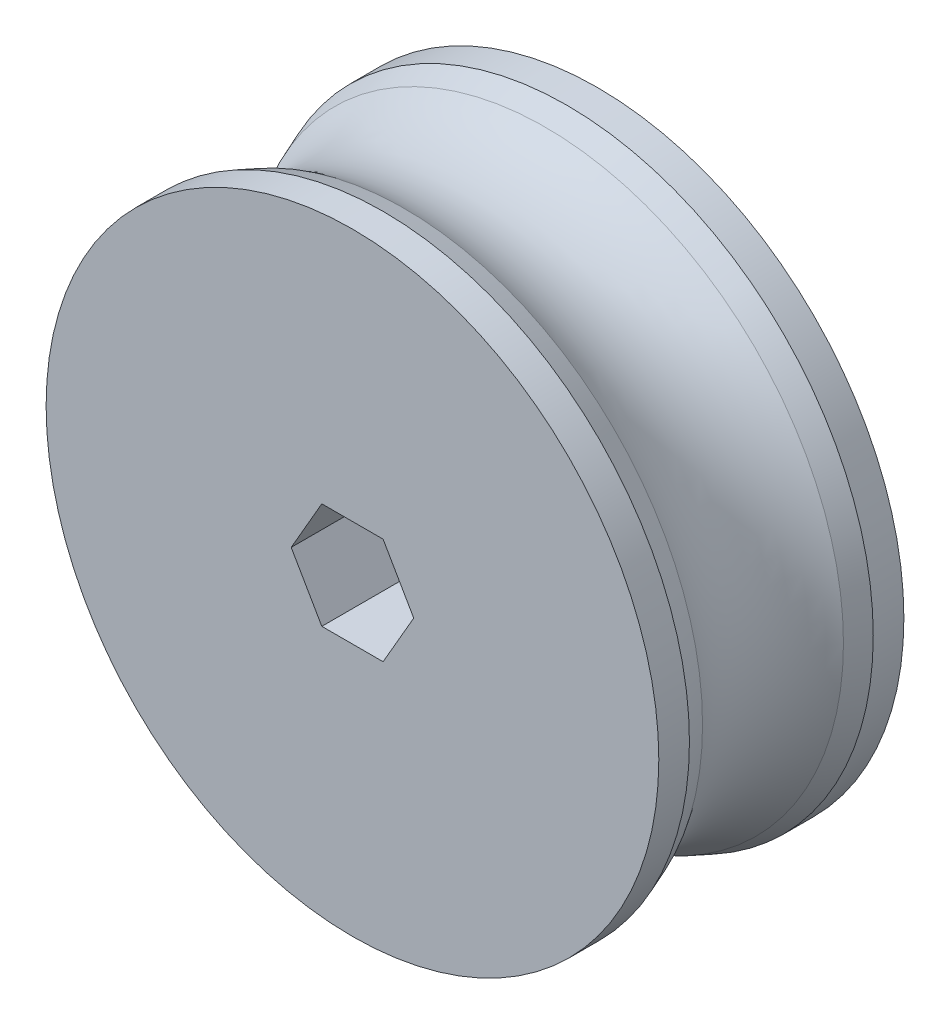
ISO-10303-21;
HEADER;
FILE_DESCRIPTION(('STEP AP214'),'2;1');
FILE_NAME('part.step','',(''),(''),'','','');
FILE_SCHEMA(('AUTOMOTIVE_DESIGN { 1 0 10303 214 1 1 1 1 }'));
ENDSEC;
DATA;
#1=APPLICATION_CONTEXT('core data for automotive mechanical design processes');
#2=APPLICATION_PROTOCOL_DEFINITION('international standard','automotive_design',2000,#1);
#3=PRODUCT_CONTEXT('',#1,'mechanical');
#4=PRODUCT('Part','Part','',(#3));
#5=PRODUCT_RELATED_PRODUCT_CATEGORY('part','',(#4));
#6=PRODUCT_DEFINITION_FORMATION('','',#4);
#7=PRODUCT_DEFINITION_CONTEXT('part definition',#1,'design');
#8=PRODUCT_DEFINITION('design','',#6,#7);
#9=PRODUCT_DEFINITION_SHAPE('','',#8);
#10=(LENGTH_UNIT() NAMED_UNIT(*) SI_UNIT(.MILLI.,.METRE.));
#11=(NAMED_UNIT(*) PLANE_ANGLE_UNIT() SI_UNIT($,.RADIAN.));
#12=(NAMED_UNIT(*) SI_UNIT($,.STERADIAN.) SOLID_ANGLE_UNIT());
#13=UNCERTAINTY_MEASURE_WITH_UNIT(LENGTH_MEASURE(1.E-05),#10,'distance_accuracy_value','');
#14=(GEOMETRIC_REPRESENTATION_CONTEXT(3) GLOBAL_UNCERTAINTY_ASSIGNED_CONTEXT((#13)) GLOBAL_UNIT_ASSIGNED_CONTEXT((#10,
#11,#12)) REPRESENTATION_CONTEXT('',''));
#15=CARTESIAN_POINT('',(0.,0.,0.));
#16=DIRECTION('',(0.,0.,1.));
#17=DIRECTION('',(1.,0.,0.));
#18=AXIS2_PLACEMENT_3D('',#15,#16,#17);
#19=CARTESIAN_POINT('',(0.,0.,20.));
#20=DIRECTION('',(0.,0.,-1.));
#21=DIRECTION('',(-1.,0.,0.));
#22=AXIS2_PLACEMENT_3D('',#19,#20,#21);
#23=CYLINDRICAL_SURFACE('',#22,25.);
#24=CARTESIAN_POINT('',(0.,0.,20.));
#25=DIRECTION('',(0.,0.,1.));
#26=DIRECTION('',(1.,0.,0.));
#27=AXIS2_PLACEMENT_3D('',#24,#25,#26);
#28=CIRCLE('',#27,25.);
#29=CARTESIAN_POINT('',(25.,0.,20.));
#30=VERTEX_POINT('',#29);
#31=EDGE_CURVE('E11',#30,#30,#28,.T.);
#32=ORIENTED_EDGE('',*,*,#31,.F.);
#33=EDGE_LOOP('',(#32));
#34=FACE_BOUND('',#33,.T.);
#35=CARTESIAN_POINT('',(0.,0.,17.5));
#36=DIRECTION('',(0.,0.,1.));
#37=DIRECTION('',(1.,0.,0.));
#38=AXIS2_PLACEMENT_3D('',#35,#36,#37);
#39=CIRCLE('',#38,25.);
#40=CARTESIAN_POINT('',(25.,0.,17.5));
#41=VERTEX_POINT('',#40);
#42=EDGE_CURVE('E131',#41,#41,#39,.T.);
#43=ORIENTED_EDGE('',*,*,#42,.T.);
#44=EDGE_LOOP('',(#43));
#45=FACE_BOUND('',#44,.T.);
#46=ADVANCED_FACE('F33',(#34,#45),#23,.T.);
#47=CARTESIAN_POINT('',(0.,0.,20.));
#48=DIRECTION('',(0.,0.,1.));
#49=DIRECTION('',(1.,0.,0.));
#50=AXIS2_PLACEMENT_3D('',#47,#48,#49);
#51=PLANE('',#50);
#52=DIRECTION('',(-0.5,0.866025403784439,0.));
#53=VECTOR('',#52,1.);
#54=CARTESIAN_POINT('',(-2.5,-4.3301270189222,20.));
#55=LINE('',#54,#53);
#56=CARTESIAN_POINT('',(-2.5,-4.3301270189222,20.));
#57=VERTEX_POINT('',#56);
#58=CARTESIAN_POINT('',(-5.,0.,20.));
#59=VERTEX_POINT('',#58);
#60=EDGE_CURVE('E88',#57,#59,#55,.T.);
#61=ORIENTED_EDGE('',*,*,#60,.T.);
#62=DIRECTION('',(0.5,0.866025403784439,0.));
#63=VECTOR('',#62,1.);
#64=CARTESIAN_POINT('',(-5.,0.,20.));
#65=LINE('',#64,#63);
#66=CARTESIAN_POINT('',(-2.5,4.33012701892219,20.));
#67=VERTEX_POINT('',#66);
#68=EDGE_CURVE('E97',#59,#67,#65,.T.);
#69=ORIENTED_EDGE('',*,*,#68,.T.);
#70=DIRECTION('',(1.,0.,0.));
#71=VECTOR('',#70,1.);
#72=CARTESIAN_POINT('',(-2.5,4.33012701892219,20.));
#73=LINE('',#72,#71);
#74=CARTESIAN_POINT('',(2.5,4.3301270189222,20.));
#75=VERTEX_POINT('',#74);
#76=EDGE_CURVE('E48',#67,#75,#73,.T.);
#77=ORIENTED_EDGE('',*,*,#76,.T.);
#78=DIRECTION('',(0.5,-0.866025403784439,0.));
#79=VECTOR('',#78,1.);
#80=CARTESIAN_POINT('',(2.5,4.3301270189222,20.));
#81=LINE('',#80,#79);
#82=CARTESIAN_POINT('',(5.,0.,20.));
#83=VERTEX_POINT('',#82);
#84=EDGE_CURVE('E112',#75,#83,#81,.T.);
#85=ORIENTED_EDGE('',*,*,#84,.T.);
#86=DIRECTION('',(-0.5,-0.866025403784439,0.));
#87=VECTOR('',#86,1.);
#88=CARTESIAN_POINT('',(5.,0.,20.));
#89=LINE('',#88,#87);
#90=CARTESIAN_POINT('',(2.5,-4.33012701892219,20.));
#91=VERTEX_POINT('',#90);
#92=EDGE_CURVE('E115',#83,#91,#89,.T.);
#93=ORIENTED_EDGE('',*,*,#92,.T.);
#94=DIRECTION('',(-1.,0.,0.));
#95=VECTOR('',#94,1.);
#96=CARTESIAN_POINT('',(2.5,-4.33012701892219,20.));
#97=LINE('',#96,#95);
#98=EDGE_CURVE('E94',#91,#57,#97,.T.);
#99=ORIENTED_EDGE('',*,*,#98,.T.);
#100=EDGE_LOOP('',(#61,#69,#77,#85,#93,#99));
#101=FACE_BOUND('',#100,.T.);
#102=ORIENTED_EDGE('',*,*,#31,.T.);
#103=EDGE_LOOP('',(#102));
#104=FACE_BOUND('',#103,.T.);
#105=ADVANCED_FACE('F101',(#101,#104),#51,.T.);
#106=CARTESIAN_POINT('',(0.,0.,17.5));
#107=DIRECTION('',(0.,0.,1.));
#108=DIRECTION('',(1.,0.,0.));
#109=AXIS2_PLACEMENT_3D('',#106,#107,#108);
#110=CONICAL_SURFACE('',#109,25.,0.371376901923299);
#111=CARTESIAN_POINT('',(0.,0.,15.75));
#112=DIRECTION('',(0.,0.,1.));
#113=DIRECTION('',(1.,0.,0.));
#114=AXIS2_PLACEMENT_3D('',#111,#112,#113);
#115=CIRCLE('',#114,24.3184659140232);
#116=CARTESIAN_POINT('',(24.3184659140232,0.,15.75));
#117=VERTEX_POINT('',#116);
#118=EDGE_CURVE('E147',#117,#117,#115,.T.);
#119=ORIENTED_EDGE('',*,*,#118,.T.);
#120=EDGE_LOOP('',(#119));
#121=FACE_BOUND('',#120,.T.);
#122=ORIENTED_EDGE('',*,*,#42,.F.);
#123=EDGE_LOOP('',(#122));
#124=FACE_BOUND('',#123,.T.);
#125=ADVANCED_FACE('F173',(#121,#124),#110,.T.);
#126=CARTESIAN_POINT('',(0.,0.,10.));
#127=DIRECTION('',(0.,0.,1.));
#128=DIRECTION('',(1.,0.,0.));
#129=AXIS2_PLACEMENT_3D('',#126,#127,#128);
#130=TOROIDAL_SURFACE('',#129,32.5,10.);
#131=CARTESIAN_POINT('',(0.,0.,4.25));
#132=DIRECTION('',(0.,0.,1.));
#133=DIRECTION('',(1.,0.,0.));
#134=AXIS2_PLACEMENT_3D('',#131,#132,#133);
#135=CIRCLE('',#134,24.3184659140232);
#136=CARTESIAN_POINT('',(24.3184659140232,0.,4.25));
#137=VERTEX_POINT('',#136);
#138=EDGE_CURVE('E144',#137,#137,#135,.T.);
#139=ORIENTED_EDGE('',*,*,#138,.T.);
#140=EDGE_LOOP('',(#139));
#141=FACE_BOUND('',#140,.T.);
#142=ORIENTED_EDGE('',*,*,#118,.F.);
#143=EDGE_LOOP('',(#142));
#144=FACE_BOUND('',#143,.T.);
#145=ADVANCED_FACE('F164',(#141,#144),#130,.F.);
#146=CARTESIAN_POINT('',(0.,0.,2.5));
#147=DIRECTION('',(0.,0.,-1.));
#148=DIRECTION('',(-1.,0.,0.));
#149=AXIS2_PLACEMENT_3D('',#146,#147,#148);
#150=CONICAL_SURFACE('',#149,25.,0.371376901923301);
#151=ORIENTED_EDGE('',*,*,#138,.F.);
#152=EDGE_LOOP('',(#151));
#153=FACE_BOUND('',#152,.T.);
#154=CARTESIAN_POINT('',(0.,0.,2.5));
#155=DIRECTION('',(0.,0.,1.));
#156=DIRECTION('',(1.,0.,0.));
#157=AXIS2_PLACEMENT_3D('',#154,#155,#156);
#158=CIRCLE('',#157,25.);
#159=CARTESIAN_POINT('',(25.,0.,2.5));
#160=VERTEX_POINT('',#159);
#161=EDGE_CURVE('E141',#160,#160,#158,.T.);
#162=ORIENTED_EDGE('',*,*,#161,.T.);
#163=EDGE_LOOP('',(#162));
#164=FACE_BOUND('',#163,.T.);
#165=ADVANCED_FACE('F157',(#153,#164),#150,.T.);
#166=CARTESIAN_POINT('',(0.,0.,0.));
#167=DIRECTION('',(0.,0.,1.));
#168=DIRECTION('',(1.,0.,0.));
#169=AXIS2_PLACEMENT_3D('',#166,#167,#168);
#170=PLANE('',#169);
#171=DIRECTION('',(0.5,0.866025403784439,0.));
#172=VECTOR('',#171,1.);
#173=CARTESIAN_POINT('',(-5.,0.,0.));
#174=LINE('',#173,#172);
#175=CARTESIAN_POINT('',(-5.,0.,0.));
#176=VERTEX_POINT('',#175);
#177=CARTESIAN_POINT('',(-2.5,4.33012701892219,0.));
#178=VERTEX_POINT('',#177);
#179=EDGE_CURVE('E119',#176,#178,#174,.T.);
#180=ORIENTED_EDGE('',*,*,#179,.F.);
#181=DIRECTION('',(-0.5,0.866025403784439,0.));
#182=VECTOR('',#181,1.);
#183=CARTESIAN_POINT('',(-2.5,-4.3301270189222,0.));
#184=LINE('',#183,#182);
#185=CARTESIAN_POINT('',(-2.5,-4.3301270189222,0.));
#186=VERTEX_POINT('',#185);
#187=EDGE_CURVE('E56',#186,#176,#184,.T.);
#188=ORIENTED_EDGE('',*,*,#187,.F.);
#189=DIRECTION('',(-1.,0.,0.));
#190=VECTOR('',#189,1.);
#191=CARTESIAN_POINT('',(2.5,-4.33012701892219,0.));
#192=LINE('',#191,#190);
#193=CARTESIAN_POINT('',(2.5,-4.33012701892219,0.));
#194=VERTEX_POINT('',#193);
#195=EDGE_CURVE('E105',#194,#186,#192,.T.);
#196=ORIENTED_EDGE('',*,*,#195,.F.);
#197=DIRECTION('',(-0.5,-0.866025403784439,0.));
#198=VECTOR('',#197,1.);
#199=CARTESIAN_POINT('',(5.,0.,0.));
#200=LINE('',#199,#198);
#201=CARTESIAN_POINT('',(5.,0.,0.));
#202=VERTEX_POINT('',#201);
#203=EDGE_CURVE('E108',#202,#194,#200,.T.);
#204=ORIENTED_EDGE('',*,*,#203,.F.);
#205=DIRECTION('',(0.5,-0.866025403784439,0.));
#206=VECTOR('',#205,1.);
#207=CARTESIAN_POINT('',(2.5,4.3301270189222,0.));
#208=LINE('',#207,#206);
#209=CARTESIAN_POINT('',(2.5,4.3301270189222,0.));
#210=VERTEX_POINT('',#209);
#211=EDGE_CURVE('E124',#210,#202,#208,.T.);
#212=ORIENTED_EDGE('',*,*,#211,.F.);
#213=DIRECTION('',(1.,0.,0.));
#214=VECTOR('',#213,1.);
#215=CARTESIAN_POINT('',(-2.5,4.33012701892219,0.));
#216=LINE('',#215,#214);
#217=EDGE_CURVE('E121',#178,#210,#216,.T.);
#218=ORIENTED_EDGE('',*,*,#217,.F.);
#219=EDGE_LOOP('',(#180,#188,#196,#204,#212,#218));
#220=FACE_BOUND('',#219,.T.);
#221=CARTESIAN_POINT('',(0.,0.,0.));
#222=DIRECTION('',(0.,0.,1.));
#223=DIRECTION('',(1.,0.,0.));
#224=AXIS2_PLACEMENT_3D('',#221,#222,#223);
#225=CIRCLE('',#224,25.);
#226=CARTESIAN_POINT('',(25.,0.,0.));
#227=VERTEX_POINT('',#226);
#228=EDGE_CURVE('E37',#227,#227,#225,.T.);
#229=ORIENTED_EDGE('',*,*,#228,.F.);
#230=EDGE_LOOP('',(#229));
#231=FACE_BOUND('',#230,.T.);
#232=ADVANCED_FACE('F155',(#220,#231),#170,.F.);
#233=ORIENTED_EDGE('',*,*,#161,.F.);
#234=EDGE_LOOP('',(#233));
#235=FACE_BOUND('',#234,.T.);
#236=ORIENTED_EDGE('',*,*,#228,.T.);
#237=EDGE_LOOP('',(#236));
#238=FACE_BOUND('',#237,.T.);
#239=ADVANCED_FACE('F35',(#235,#238),#23,.T.);
#240=CARTESIAN_POINT('',(-2.5,-4.3301270189222,20.));
#241=DIRECTION('',(-0.866025403784439,-0.5,0.));
#242=DIRECTION('',(0.5,-0.866025403784439,0.));
#243=AXIS2_PLACEMENT_3D('',#240,#241,#242);
#244=PLANE('',#243);
#245=ORIENTED_EDGE('',*,*,#187,.T.);
#246=DIRECTION('',(0.,0.,-1.));
#247=VECTOR('',#246,1.);
#248=CARTESIAN_POINT('',(-5.,0.,20.));
#249=LINE('',#248,#247);
#250=EDGE_CURVE('E84',#59,#176,#249,.T.);
#251=ORIENTED_EDGE('',*,*,#250,.F.);
#252=ORIENTED_EDGE('',*,*,#60,.F.);
#253=DIRECTION('',(0.,0.,-1.));
#254=VECTOR('',#253,1.);
#255=CARTESIAN_POINT('',(-2.5,-4.3301270189222,20.));
#256=LINE('',#255,#254);
#257=EDGE_CURVE('E129',#57,#186,#256,.T.);
#258=ORIENTED_EDGE('',*,*,#257,.T.);
#259=EDGE_LOOP('',(#245,#251,#252,#258));
#260=FACE_BOUND('',#259,.T.);
#261=ADVANCED_FACE('F86',(#260),#244,.F.);
#262=CARTESIAN_POINT('',(2.5,-4.33012701892219,20.));
#263=DIRECTION('',(0.,-1.,0.));
#264=DIRECTION('',(1.,0.,0.));
#265=AXIS2_PLACEMENT_3D('',#262,#263,#264);
#266=PLANE('',#265);
#267=ORIENTED_EDGE('',*,*,#195,.T.);
#268=ORIENTED_EDGE('',*,*,#257,.F.);
#269=ORIENTED_EDGE('',*,*,#98,.F.);
#270=DIRECTION('',(0.,0.,-1.));
#271=VECTOR('',#270,1.);
#272=CARTESIAN_POINT('',(2.5,-4.33012701892219,20.));
#273=LINE('',#272,#271);
#274=EDGE_CURVE('E132',#91,#194,#273,.T.);
#275=ORIENTED_EDGE('',*,*,#274,.T.);
#276=EDGE_LOOP('',(#267,#268,#269,#275));
#277=FACE_BOUND('',#276,.T.);
#278=ADVANCED_FACE('F188',(#277),#266,.F.);
#279=CARTESIAN_POINT('',(5.,0.,20.));
#280=DIRECTION('',(0.866025403784439,-0.5,0.));
#281=DIRECTION('',(0.5,0.866025403784439,0.));
#282=AXIS2_PLACEMENT_3D('',#279,#280,#281);
#283=PLANE('',#282);
#284=ORIENTED_EDGE('',*,*,#203,.T.);
#285=ORIENTED_EDGE('',*,*,#274,.F.);
#286=ORIENTED_EDGE('',*,*,#92,.F.);
#287=DIRECTION('',(0.,0.,-1.));
#288=VECTOR('',#287,1.);
#289=CARTESIAN_POINT('',(5.,0.,20.));
#290=LINE('',#289,#288);
#291=EDGE_CURVE('E134',#83,#202,#290,.T.);
#292=ORIENTED_EDGE('',*,*,#291,.T.);
#293=EDGE_LOOP('',(#284,#285,#286,#292));
#294=FACE_BOUND('',#293,.T.);
#295=ADVANCED_FACE('F197',(#294),#283,.F.);
#296=CARTESIAN_POINT('',(2.5,4.3301270189222,20.));
#297=DIRECTION('',(0.866025403784439,0.5,0.));
#298=DIRECTION('',(-0.5,0.866025403784439,0.));
#299=AXIS2_PLACEMENT_3D('',#296,#297,#298);
#300=PLANE('',#299);
#301=ORIENTED_EDGE('',*,*,#211,.T.);
#302=ORIENTED_EDGE('',*,*,#291,.F.);
#303=ORIENTED_EDGE('',*,*,#84,.F.);
#304=DIRECTION('',(0.,0.,-1.));
#305=VECTOR('',#304,1.);
#306=CARTESIAN_POINT('',(2.5,4.3301270189222,20.));
#307=LINE('',#306,#305);
#308=EDGE_CURVE('E136',#75,#210,#307,.T.);
#309=ORIENTED_EDGE('',*,*,#308,.T.);
#310=EDGE_LOOP('',(#301,#302,#303,#309));
#311=FACE_BOUND('',#310,.T.);
#312=ADVANCED_FACE('F194',(#311),#300,.F.);
#313=CARTESIAN_POINT('',(-2.5,4.33012701892219,20.));
#314=DIRECTION('',(0.,1.,0.));
#315=DIRECTION('',(-1.,0.,0.));
#316=AXIS2_PLACEMENT_3D('',#313,#314,#315);
#317=PLANE('',#316);
#318=ORIENTED_EDGE('',*,*,#217,.T.);
#319=ORIENTED_EDGE('',*,*,#308,.F.);
#320=ORIENTED_EDGE('',*,*,#76,.F.);
#321=DIRECTION('',(0.,0.,-1.));
#322=VECTOR('',#321,1.);
#323=CARTESIAN_POINT('',(-2.5,4.33012701892219,20.));
#324=LINE('',#323,#322);
#325=EDGE_CURVE('E93',#67,#178,#324,.T.);
#326=ORIENTED_EDGE('',*,*,#325,.T.);
#327=EDGE_LOOP('',(#318,#319,#320,#326));
#328=FACE_BOUND('',#327,.T.);
#329=ADVANCED_FACE('F191',(#328),#317,.F.);
#330=CARTESIAN_POINT('',(-5.,0.,20.));
#331=DIRECTION('',(-0.866025403784439,0.5,0.));
#332=DIRECTION('',(-0.5,-0.866025403784439,0.));
#333=AXIS2_PLACEMENT_3D('',#330,#331,#332);
#334=PLANE('',#333);
#335=ORIENTED_EDGE('',*,*,#179,.T.);
#336=ORIENTED_EDGE('',*,*,#325,.F.);
#337=ORIENTED_EDGE('',*,*,#68,.F.);
#338=ORIENTED_EDGE('',*,*,#250,.T.);
#339=EDGE_LOOP('',(#335,#336,#337,#338));
#340=FACE_BOUND('',#339,.T.);
#341=ADVANCED_FACE('F98',(#340),#334,.F.);
#342=CLOSED_SHELL('',(#46,#105,#125,#145,#165,#232,#239,#261,#278,#295,#312,#329,#341));
#343=MANIFOLD_SOLID_BREP('B2',#342);
#344=ADVANCED_BREP_SHAPE_REPRESENTATION('',(#18,#343),#14);
#345=SHAPE_DEFINITION_REPRESENTATION(#9,#344);
ENDSEC;
END-ISO-10303-21;
